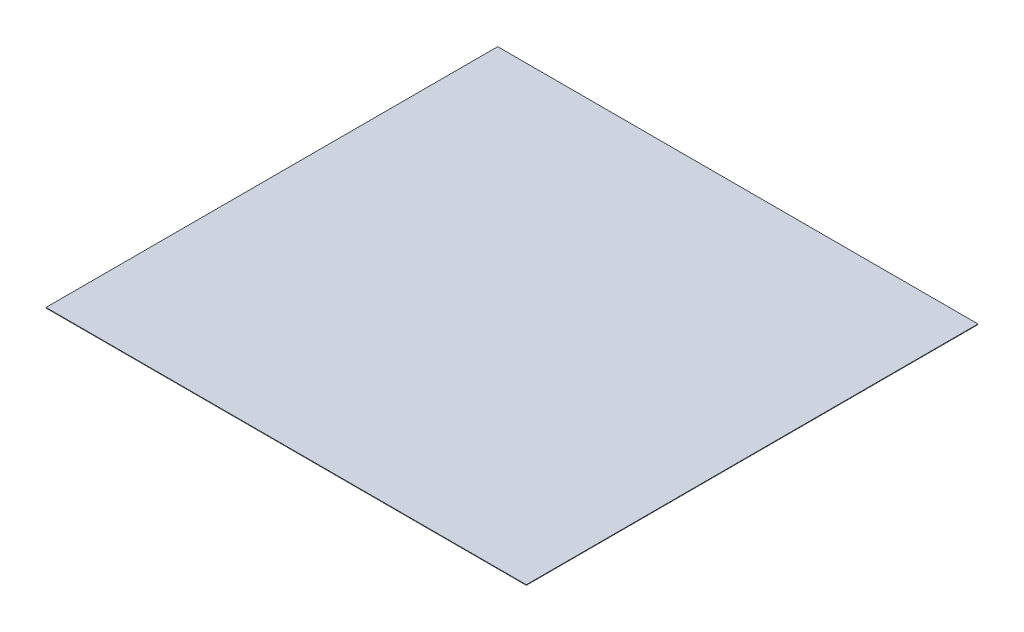
ISO-10303-21;
HEADER;
FILE_DESCRIPTION(('STEP AP214'),'2;1');
FILE_NAME('part.step','',(''),(''),'','','');
FILE_SCHEMA(('AUTOMOTIVE_DESIGN { 1 0 10303 214 1 1 1 1 }'));
ENDSEC;
DATA;
#1=APPLICATION_CONTEXT('core data for automotive mechanical design processes');
#2=APPLICATION_PROTOCOL_DEFINITION('international standard','automotive_design',2000,#1);
#3=PRODUCT_CONTEXT('',#1,'mechanical');
#4=PRODUCT('Part','Part','',(#3));
#5=PRODUCT_RELATED_PRODUCT_CATEGORY('part','',(#4));
#6=PRODUCT_DEFINITION_FORMATION('','',#4);
#7=PRODUCT_DEFINITION_CONTEXT('part definition',#1,'design');
#8=PRODUCT_DEFINITION('design','',#6,#7);
#9=PRODUCT_DEFINITION_SHAPE('','',#8);
#10=(LENGTH_UNIT() NAMED_UNIT(*) SI_UNIT(.MILLI.,.METRE.));
#11=(NAMED_UNIT(*) PLANE_ANGLE_UNIT() SI_UNIT($,.RADIAN.));
#12=(NAMED_UNIT(*) SI_UNIT($,.STERADIAN.) SOLID_ANGLE_UNIT());
#13=UNCERTAINTY_MEASURE_WITH_UNIT(LENGTH_MEASURE(1.E-05),#10,'distance_accuracy_value','');
#14=(GEOMETRIC_REPRESENTATION_CONTEXT(3) GLOBAL_UNCERTAINTY_ASSIGNED_CONTEXT((#13)) GLOBAL_UNIT_ASSIGNED_CONTEXT((#10,
#11,#12)) REPRESENTATION_CONTEXT('',''));
#15=CARTESIAN_POINT('',(0.,0.,0.));
#16=DIRECTION('',(0.,0.,1.));
#17=DIRECTION('',(1.,0.,0.));
#18=AXIS2_PLACEMENT_3D('',#15,#16,#17);
#19=CARTESIAN_POINT('',(0.,0.,0.));
#20=DIRECTION('',(0.,0.,-1.));
#21=DIRECTION('',(1.,0.,0.));
#22=AXIS2_PLACEMENT_3D('',#19,#20,#21);
#23=PLANE('',#22);
#24=DIRECTION('',(0.,-1.,0.));
#25=VECTOR('',#24,1.);
#26=CARTESIAN_POINT('',(0.,0.,0.));
#27=LINE('',#26,#25);
#28=CARTESIAN_POINT('',(0.,0.,0.));
#29=VERTEX_POINT('',#28);
#30=CARTESIAN_POINT('',(0.,-0.5,0.));
#31=VERTEX_POINT('',#30);
#32=EDGE_CURVE('E11',#29,#31,#27,.T.);
#33=ORIENTED_EDGE('',*,*,#32,.F.);
#34=DIRECTION('',(1.,0.,0.));
#35=VECTOR('',#34,1.);
#36=CARTESIAN_POINT('',(0.,0.,0.));
#37=LINE('',#36,#35);
#38=CARTESIAN_POINT('',(446.64,0.,0.));
#39=VERTEX_POINT('',#38);
#40=EDGE_CURVE('E109',#29,#39,#37,.T.);
#41=ORIENTED_EDGE('',*,*,#40,.T.);
#42=DIRECTION('',(0.,-1.,0.));
#43=VECTOR('',#42,1.);
#44=CARTESIAN_POINT('',(446.64,0.,0.));
#45=LINE('',#44,#43);
#46=CARTESIAN_POINT('',(446.64,-0.5,0.));
#47=VERTEX_POINT('',#46);
#48=EDGE_CURVE('E56',#39,#47,#45,.T.);
#49=ORIENTED_EDGE('',*,*,#48,.T.);
#50=DIRECTION('',(1.,0.,0.));
#51=VECTOR('',#50,1.);
#52=CARTESIAN_POINT('',(0.,-0.5,0.));
#53=LINE('',#52,#51);
#54=EDGE_CURVE('E124',#31,#47,#53,.T.);
#55=ORIENTED_EDGE('',*,*,#54,.F.);
#56=EDGE_LOOP('',(#33,#41,#49,#55));
#57=FACE_BOUND('',#56,.T.);
#58=ADVANCED_FACE('F45',(#57),#23,.T.);
#59=CARTESIAN_POINT('',(446.64,0.,0.));
#60=DIRECTION('',(1.,0.,0.));
#61=DIRECTION('',(0.,0.,1.));
#62=AXIS2_PLACEMENT_3D('',#59,#60,#61);
#63=PLANE('',#62);
#64=ORIENTED_EDGE('',*,*,#48,.F.);
#65=DIRECTION('',(0.,0.,1.));
#66=VECTOR('',#65,1.);
#67=CARTESIAN_POINT('',(446.64,0.,0.));
#68=LINE('',#67,#66);
#69=CARTESIAN_POINT('',(446.64,0.,420.));
#70=VERTEX_POINT('',#69);
#71=EDGE_CURVE('E103',#39,#70,#68,.T.);
#72=ORIENTED_EDGE('',*,*,#71,.T.);
#73=DIRECTION('',(0.,-1.,0.));
#74=VECTOR('',#73,1.);
#75=CARTESIAN_POINT('',(446.64,0.,420.));
#76=LINE('',#75,#74);
#77=CARTESIAN_POINT('',(446.64,-0.5,420.));
#78=VERTEX_POINT('',#77);
#79=EDGE_CURVE('E87',#70,#78,#76,.T.);
#80=ORIENTED_EDGE('',*,*,#79,.T.);
#81=DIRECTION('',(0.,0.,-1.));
#82=VECTOR('',#81,1.);
#83=CARTESIAN_POINT('',(446.64,-0.5,0.));
#84=LINE('',#83,#82);
#85=EDGE_CURVE('E122',#47,#78,#84,.F.);
#86=ORIENTED_EDGE('',*,*,#85,.F.);
#87=EDGE_LOOP('',(#64,#72,#80,#86));
#88=FACE_BOUND('',#87,.T.);
#89=ADVANCED_FACE('F107',(#88),#63,.T.);
#90=CARTESIAN_POINT('',(0.,0.,420.));
#91=DIRECTION('',(0.,0.,-1.));
#92=DIRECTION('',(1.,0.,0.));
#93=AXIS2_PLACEMENT_3D('',#90,#91,#92);
#94=PLANE('',#93);
#95=ORIENTED_EDGE('',*,*,#79,.F.);
#96=DIRECTION('',(1.,0.,0.));
#97=VECTOR('',#96,1.);
#98=CARTESIAN_POINT('',(0.,0.,420.));
#99=LINE('',#98,#97);
#100=CARTESIAN_POINT('',(0.,0.,420.));
#101=VERTEX_POINT('',#100);
#102=EDGE_CURVE('E90',#101,#70,#99,.T.);
#103=ORIENTED_EDGE('',*,*,#102,.F.);
#104=DIRECTION('',(0.,-1.,0.));
#105=VECTOR('',#104,1.);
#106=CARTESIAN_POINT('',(0.,0.,420.));
#107=LINE('',#106,#105);
#108=CARTESIAN_POINT('',(0.,-0.5,420.));
#109=VERTEX_POINT('',#108);
#110=EDGE_CURVE('E49',#101,#109,#107,.T.);
#111=ORIENTED_EDGE('',*,*,#110,.T.);
#112=DIRECTION('',(1.,0.,0.));
#113=VECTOR('',#112,1.);
#114=CARTESIAN_POINT('',(0.,-0.5,420.));
#115=LINE('',#114,#113);
#116=EDGE_CURVE('E92',#109,#78,#115,.T.);
#117=ORIENTED_EDGE('',*,*,#116,.T.);
#118=EDGE_LOOP('',(#95,#103,#111,#117));
#119=FACE_BOUND('',#118,.T.);
#120=ADVANCED_FACE('F89',(#119),#94,.F.);
#121=CARTESIAN_POINT('',(0.,0.,0.));
#122=DIRECTION('',(1.,0.,0.));
#123=DIRECTION('',(0.,0.,1.));
#124=AXIS2_PLACEMENT_3D('',#121,#122,#123);
#125=PLANE('',#124);
#126=DIRECTION('',(0.,0.,1.));
#127=VECTOR('',#126,1.);
#128=CARTESIAN_POINT('',(0.,0.,0.));
#129=LINE('',#128,#127);
#130=EDGE_CURVE('E104',#29,#101,#129,.T.);
#131=ORIENTED_EDGE('',*,*,#130,.F.);
#132=ORIENTED_EDGE('',*,*,#32,.T.);
#133=DIRECTION('',(0.,0.,-1.));
#134=VECTOR('',#133,1.);
#135=CARTESIAN_POINT('',(0.,-0.5,0.));
#136=LINE('',#135,#134);
#137=EDGE_CURVE('E113',#31,#109,#136,.F.);
#138=ORIENTED_EDGE('',*,*,#137,.T.);
#139=ORIENTED_EDGE('',*,*,#110,.F.);
#140=EDGE_LOOP('',(#131,#132,#138,#139));
#141=FACE_BOUND('',#140,.T.);
#142=ADVANCED_FACE('F47',(#141),#125,.F.);
#143=CARTESIAN_POINT('',(0.,-0.5,0.));
#144=DIRECTION('',(0.,-1.,0.));
#145=DIRECTION('',(0.,0.,-1.));
#146=AXIS2_PLACEMENT_3D('',#143,#144,#145);
#147=PLANE('',#146);
#148=ORIENTED_EDGE('',*,*,#116,.F.);
#149=ORIENTED_EDGE('',*,*,#137,.F.);
#150=ORIENTED_EDGE('',*,*,#54,.T.);
#151=ORIENTED_EDGE('',*,*,#85,.T.);
#152=EDGE_LOOP('',(#148,#149,#150,#151));
#153=FACE_BOUND('',#152,.T.);
#154=ADVANCED_FACE('F131',(#153),#147,.T.);
#155=CARTESIAN_POINT('',(0.,0.,0.));
#156=DIRECTION('',(0.,-1.,0.));
#157=DIRECTION('',(0.,0.,-1.));
#158=AXIS2_PLACEMENT_3D('',#155,#156,#157);
#159=PLANE('',#158);
#160=ORIENTED_EDGE('',*,*,#102,.T.);
#161=ORIENTED_EDGE('',*,*,#71,.F.);
#162=ORIENTED_EDGE('',*,*,#40,.F.);
#163=ORIENTED_EDGE('',*,*,#130,.T.);
#164=EDGE_LOOP('',(#160,#161,#162,#163));
#165=FACE_BOUND('',#164,.T.);
#166=ADVANCED_FACE('F101',(#165),#159,.F.);
#167=CLOSED_SHELL('',(#58,#89,#120,#142,#154,#166));
#168=MANIFOLD_SOLID_BREP('B2',#167);
#169=ADVANCED_BREP_SHAPE_REPRESENTATION('',(#18,#168),#14);
#170=SHAPE_DEFINITION_REPRESENTATION(#9,#169);
ENDSEC;
END-ISO-10303-21;
